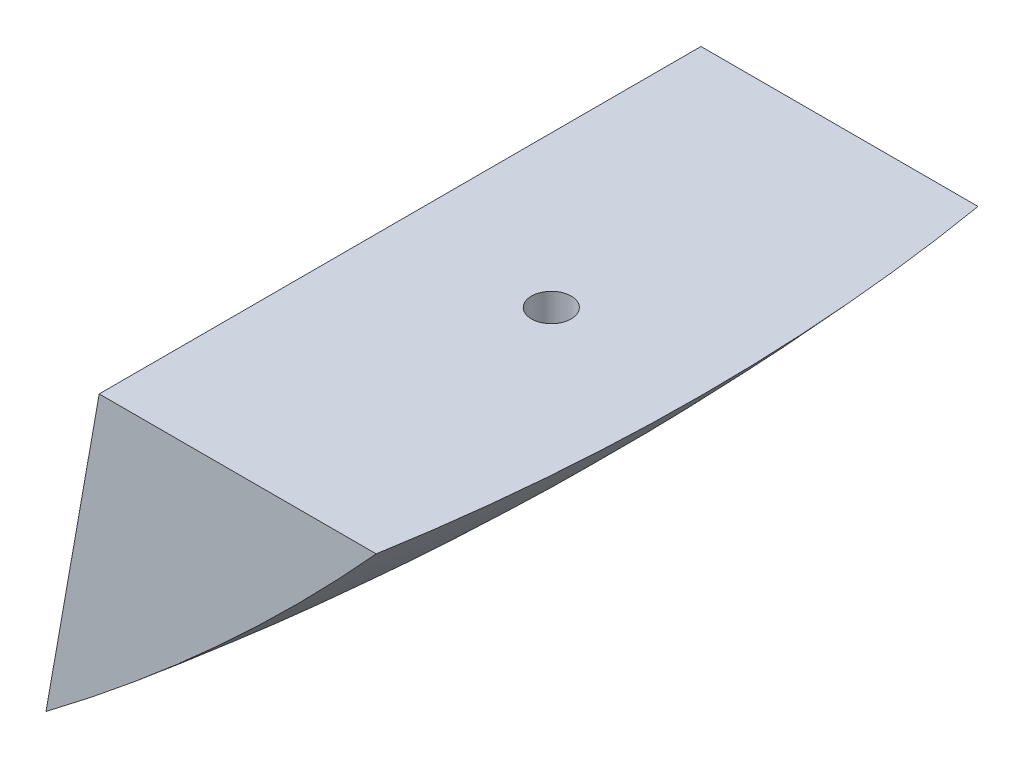
ISO-10303-21;
HEADER;
FILE_DESCRIPTION(('STEP AP214'),'2;1');
FILE_NAME('part.step','',(''),(''),'','','');
FILE_SCHEMA(('AUTOMOTIVE_DESIGN { 1 0 10303 214 1 1 1 1 }'));
ENDSEC;
DATA;
#1=APPLICATION_CONTEXT('core data for automotive mechanical design processes');
#2=APPLICATION_PROTOCOL_DEFINITION('international standard','automotive_design',2000,#1);
#3=PRODUCT_CONTEXT('',#1,'mechanical');
#4=PRODUCT('Part','Part','',(#3));
#5=PRODUCT_RELATED_PRODUCT_CATEGORY('part','',(#4));
#6=PRODUCT_DEFINITION_FORMATION('','',#4);
#7=PRODUCT_DEFINITION_CONTEXT('part definition',#1,'design');
#8=PRODUCT_DEFINITION('design','',#6,#7);
#9=PRODUCT_DEFINITION_SHAPE('','',#8);
#10=(LENGTH_UNIT() NAMED_UNIT(*) SI_UNIT(.MILLI.,.METRE.));
#11=(NAMED_UNIT(*) PLANE_ANGLE_UNIT() SI_UNIT($,.RADIAN.));
#12=(NAMED_UNIT(*) SI_UNIT($,.STERADIAN.) SOLID_ANGLE_UNIT());
#13=UNCERTAINTY_MEASURE_WITH_UNIT(LENGTH_MEASURE(1.E-05),#10,'distance_accuracy_value','');
#14=(GEOMETRIC_REPRESENTATION_CONTEXT(3) GLOBAL_UNCERTAINTY_ASSIGNED_CONTEXT((#13)) GLOBAL_UNIT_ASSIGNED_CONTEXT((#10,
#11,#12)) REPRESENTATION_CONTEXT('',''));
#15=CARTESIAN_POINT('',(0.,0.,0.));
#16=DIRECTION('',(0.,0.,1.));
#17=DIRECTION('',(1.,0.,0.));
#18=AXIS2_PLACEMENT_3D('',#15,#16,#17);
#19=CARTESIAN_POINT('',(0.,89.8877777778637,0.));
#20=DIRECTION('',(0.,1.,0.));
#21=DIRECTION('',(0.819152044288991,0.,0.573576436351047));
#22=AXIS2_PLACEMENT_3D('',#19,#20,#21);
#23=SPHERICAL_SURFACE('',#22,200.025);
#24=CARTESIAN_POINT('',(135.304993525484,-57.4259187218492,-1.11089376189419));
#25=CARTESIAN_POINT('',(135.253894967539,-57.4732748733322,-1.0547755069715));
#26=CARTESIAN_POINT('',(135.205526359196,-57.5180784508502,-0.993882238328989));
#27=CARTESIAN_POINT('',(135.116170441705,-57.6008155462596,-0.862555653471321));
#28=CARTESIAN_POINT('',(135.075187110182,-57.638745362084,-0.792117231912984));
#29=CARTESIAN_POINT('',(135.00844146317,-57.7004995632273,-0.653843099320736));
#30=CARTESIAN_POINT('',(134.981311907754,-57.7255921323469,-0.587242769430468));
#31=CARTESIAN_POINT('',(134.935549252415,-57.7679111725258,-0.448827223831902));
#32=CARTESIAN_POINT('',(134.916908015399,-57.7851451770045,-0.377017079271747));
#33=CARTESIAN_POINT('',(134.88931097189,-57.8106567329115,-0.229518056935983));
#34=CARTESIAN_POINT('',(134.880413330759,-57.8188804969633,-0.153808680482446));
#35=CARTESIAN_POINT('',(134.873241361785,-57.8255094024284,-0.00145759508587165));
#36=CARTESIAN_POINT('',(134.874964419583,-57.8239169601703,0.0751838797789873));
#37=CARTESIAN_POINT('',(134.88818156645,-57.8117002223462,0.219170313374044));
#38=CARTESIAN_POINT('',(134.898697120392,-57.8019804331997,0.286687744844931));
#39=CARTESIAN_POINT('',(134.927536020641,-57.7753192227511,0.41852657622424));
#40=CARTESIAN_POINT('',(134.945860151873,-57.7583770754504,0.482847654106088));
#41=CARTESIAN_POINT('',(134.990338354715,-57.7172434818056,0.609969906726254));
#42=CARTESIAN_POINT('',(135.01682185318,-57.6927469859933,0.672555201469006));
#43=CARTESIAN_POINT('',(135.075971258397,-57.6380184373004,0.79200187419917));
#44=CARTESIAN_POINT('',(135.108640663871,-57.6077831385549,0.848859984900354));
#45=CARTESIAN_POINT('',(135.196582860327,-57.5263639028565,0.983415334934692));
#46=CARTESIAN_POINT('',(135.254988945946,-57.4722654371916,1.05731386600327));
#47=CARTESIAN_POINT('',(135.379746052147,-57.3566362334437,1.19135132064767));
#48=CARTESIAN_POINT('',(135.446115607065,-57.2950881539536,1.25145715833303));
#49=CARTESIAN_POINT('',(135.607460937307,-57.1453607689671,1.37630768446766));
#50=CARTESIAN_POINT('',(135.704573811715,-57.0551650825326,1.43586626569291));
#51=CARTESIAN_POINT('',(135.904357635023,-56.8694283863695,1.53285760930142));
#52=CARTESIAN_POINT('',(136.007031723911,-56.7738843558021,1.57027772660854));
#53=CARTESIAN_POINT('',(136.217254695792,-56.5780616808425,1.62474989288963));
#54=CARTESIAN_POINT('',(136.324860150257,-56.4777263881313,1.64137536532568));
#55=CARTESIAN_POINT('',(136.540663790621,-56.2762932720311,1.65346432617502));
#56=CARTESIAN_POINT('',(136.648862408706,-56.1751948641455,1.64890949771485));
#57=CARTESIAN_POINT('',(136.881280303974,-55.957804320785,1.61602336156161));
#58=CARTESIAN_POINT('',(137.005207153897,-55.8417485136548,1.58390414152929));
#59=CARTESIAN_POINT('',(137.246680164142,-55.6153509266891,1.48944370397862));
#60=CARTESIAN_POINT('',(137.364236642519,-55.5049999210225,1.42715308705153));
#61=CARTESIAN_POINT('',(137.546138511475,-55.3340700024225,1.29892717581881));
#62=CARTESIAN_POINT('',(137.614179475109,-55.270087167089,1.24271834143865));
#63=CARTESIAN_POINT('',(137.743126498149,-55.1487579952525,1.11659071317977));
#64=CARTESIAN_POINT('',(137.804044202156,-55.0914008294874,1.04669480889591));
#65=CARTESIAN_POINT('',(137.903658771645,-54.9975611525693,0.909586301806574));
#66=CARTESIAN_POINT('',(137.9443125928,-54.9592463143106,0.845058985192953));
#67=CARTESIAN_POINT('',(138.017498999038,-54.8902483064039,0.707794292214268));
#68=CARTESIAN_POINT('',(138.050040917857,-54.8595563658304,0.635066492817585));
#69=CARTESIAN_POINT('',(138.100518306161,-54.8119378529552,0.494845076156713));
#70=CARTESIAN_POINT('',(138.11995846047,-54.7935938524906,0.428378951334078));
#71=CARTESIAN_POINT('',(138.150476633368,-54.7647932865098,0.291897259360916));
#72=CARTESIAN_POINT('',(138.161559670389,-54.7543319874506,0.221883849350005));
#73=CARTESIAN_POINT('',(138.174602507708,-54.742020589217,0.08000716140434));
#74=CARTESIAN_POINT('',(138.176531601208,-54.7401994734405,0.00813846919916267));
#75=CARTESIAN_POINT('',(138.171032331424,-54.7453905409976,-0.134914300262591));
#76=CARTESIAN_POINT('',(138.163603517773,-54.7524031494722,-0.206098344402953));
#77=CARTESIAN_POINT('',(138.140568264184,-54.7741442783308,-0.341969938471907));
#78=CARTESIAN_POINT('',(138.125406997596,-54.788452751428,-0.406802839693003));
#79=CARTESIAN_POINT('',(138.088085385449,-54.8236673281733,-0.532513906058892));
#80=CARTESIAN_POINT('',(138.065922342887,-54.8445759741305,-0.59339053638033));
#81=CARTESIAN_POINT('',(138.006847150773,-54.900292005395,-0.730753250803811));
#82=CARTESIAN_POINT('',(137.967487535104,-54.9374028826748,-0.805254209467921));
#83=CARTESIAN_POINT('',(137.880457103447,-55.0194222733934,-0.944461739941213));
#84=CARTESIAN_POINT('',(137.832770947364,-55.0643451783984,-1.00914981494594));
#85=CARTESIAN_POINT('',(137.713945924997,-55.1762249661134,-1.1488846393099));
#86=CARTESIAN_POINT('',(137.640343113149,-55.2454827267166,-1.21998493821412));
#87=CARTESIAN_POINT('',(137.485790038894,-55.3907963349873,-1.34510204199325));
#88=CARTESIAN_POINT('',(137.404828740862,-55.4668623904597,-1.39909262448617));
#89=CARTESIAN_POINT('',(137.212909495409,-55.647026154356,-1.50487456618613));
#90=CARTESIAN_POINT('',(137.1002864849,-55.7526424838093,-1.55105934255086));
#91=CARTESIAN_POINT('',(136.87098959019,-55.967429947445,-1.61773386798331));
#92=CARTESIAN_POINT('',(136.754312760773,-56.0766036624321,-1.63820451614781));
#93=CARTESIAN_POINT('',(136.518534924434,-56.2969685929112,-1.65426277209043));
#94=CARTESIAN_POINT('',(136.39942160929,-56.4081683289469,-1.64955017685996));
#95=CARTESIAN_POINT('',(136.163037145091,-56.6285987292498,-1.61423650939765));
#96=CARTESIAN_POINT('',(136.04576627839,-56.7378290920819,-1.58363150782118));
#97=CARTESIAN_POINT('',(135.836421192942,-56.9326116562942,-1.50289655136856));
#98=CARTESIAN_POINT('',(135.74348179931,-57.019005666081,-1.45702893168549));
#99=CARTESIAN_POINT('',(135.564311167214,-57.1854198335627,-1.34559752983652));
#100=CARTESIAN_POINT('',(135.478052977955,-57.2654656338467,-1.28011869176657));
#101=CARTESIAN_POINT('',(135.365548098901,-57.3697914234781,-1.17475100583058));
#102=CARTESIAN_POINT('',(135.334806180681,-57.3982895152255,-1.1436350808583));
#103=CARTESIAN_POINT('',(135.304993525484,-57.4259187218492,-1.11089376189419));
#104=B_SPLINE_CURVE_WITH_KNOTS('',3,(#24,#25,#26,#27,#28,#29,#30,#31,#32,#33,#34,#35,#36,#37,
#38,#39,#40,#41,#42,#43,#44,#45,#46,#47,#48,#49,#50,#51,#52,#53,#54,#55,#56,#57,#58,#59,#60,#61,
#62,#63,#64,#65,#66,#67,#68,#69,#70,#71,#72,#73,#74,#75,#76,#77,#78,#79,#80,#81,#82,#83,#84,#85,
#86,#87,#88,#89,#90,#91,#92,#93,#94,#95,#96,#97,#98,#99,#100,#101,#102,#103),.UNSPECIFIED.,.T.,
.F.,(4,2,2,2,2,2,2,2,2,2,2,2,2,2,2,2,2,2,2,2,2,2,2,2,2,2,2,2,2,2,2,2,2,2,2,2,2,2,2,4),(0.,
0.268262640804345,0.536669335740845,0.764227111751158,0.991566284125334,1.22025530444012,
1.44888803358525,1.6550146627113,1.86116201677682,2.07706240867133,2.29308527960895,
2.61714204229844,2.94196820988617,3.37556322278975,3.80940565853795,4.25200918637316,
4.69499555200883,5.21085190819347,5.72584609919212,6.05184782923504,6.37730895537032,
6.63242535123113,6.88724683531151,7.10125269845404,7.31512994895825,7.52972414344342,
7.74432866610314,7.94777736778772,8.15130453134651,8.42599867436044,8.70120433490691,
9.0699017923128,9.4391616135256,9.92013144905767,10.4014583465119,10.8885357234317,
11.3756870308398,11.7790706050369,12.1807316273042,12.3372452733687),.UNSPECIFIED.);
#105=CARTESIAN_POINT('',(135.304993525484,-57.4259187218492,-1.11089376189419));
#106=VERTEX_POINT('',#105);
#107=EDGE_CURVE('E97',#106,#106,#104,.T.);
#108=ORIENTED_EDGE('',*,*,#107,.T.);
#109=EDGE_LOOP('',(#108));
#110=FACE_BOUND('',#109,.T.);
#111=CARTESIAN_POINT('',(0.,89.8877777778637,25.));
#112=DIRECTION('',(0.,0.,1.));
#113=DIRECTION('',(1.,0.,0.));
#114=AXIS2_PLACEMENT_3D('',#111,#112,#113);
#115=CIRCLE('',#114,198.456545936384);
#116=CARTESIAN_POINT('',(119.540692541846,-68.5263107736788,25.));
#117=VERTEX_POINT('',#116);
#118=CARTESIAN_POINT('',(146.978835636292,-43.4622222221363,25.));
#119=VERTEX_POINT('',#118);
#120=EDGE_CURVE('E88',#117,#119,#115,.T.);
#121=ORIENTED_EDGE('',*,*,#120,.F.);
#122=CARTESIAN_POINT('',(143.026504239129,64.6683461240922,0.));
#123=DIRECTION('',(0.984807753012209,-0.173648177666926,0.));
#124=DIRECTION('',(0.173648177666926,0.984807753012209,0.));
#125=AXIS2_PLACEMENT_3D('',#122,#123,#124);
#126=CIRCLE('',#125,137.540539395464);
#127=CARTESIAN_POINT('',(119.14284021778,-70.7826434260417,2.198420330519E-13));
#128=VERTEX_POINT('',#127);
#129=EDGE_CURVE('E92',#117,#128,#126,.T.);
#130=ORIENTED_EDGE('',*,*,#129,.T.);
#131=CARTESIAN_POINT('',(119.540692541846,-68.5263107736788,-25.));
#132=VERTEX_POINT('',#131);
#133=EDGE_CURVE('E87',#128,#132,#126,.T.);
#134=ORIENTED_EDGE('',*,*,#133,.T.);
#135=CARTESIAN_POINT('',(0.,89.8877777778637,-25.));
#136=DIRECTION('',(0.,0.,-1.));
#137=DIRECTION('',(-1.,0.,0.));
#138=AXIS2_PLACEMENT_3D('',#135,#136,#137);
#139=CIRCLE('',#138,198.456545936384);
#140=CARTESIAN_POINT('',(146.978835636292,-43.4622222221363,-25.));
#141=VERTEX_POINT('',#140);
#142=EDGE_CURVE('E60',#141,#132,#139,.T.);
#143=ORIENTED_EDGE('',*,*,#142,.F.);
#144=CARTESIAN_POINT('',(0.,-43.4622222221363,0.));
#145=DIRECTION('',(0.,1.,0.));
#146=DIRECTION('',(-1.,0.,0.));
#147=AXIS2_PLACEMENT_3D('',#144,#145,#146);
#148=CIRCLE('',#147,149.089832399798);
#149=CARTESIAN_POINT('',(149.089832399798,-43.4622222221363,0.));
#150=VERTEX_POINT('',#149);
#151=EDGE_CURVE('E53',#150,#141,#148,.T.);
#152=ORIENTED_EDGE('',*,*,#151,.F.);
#153=EDGE_CURVE('E91',#119,#150,#148,.T.);
#154=ORIENTED_EDGE('',*,*,#153,.F.);
#155=EDGE_LOOP('',(#121,#130,#134,#143,#152,#154));
#156=FACE_BOUND('',#155,.T.);
#157=ADVANCED_FACE('F38',(#110,#156),#23,.T.);
#158=CARTESIAN_POINT('',(101.542224700231,-43.4622222221363,71.1006311816865));
#159=DIRECTION('',(0.,-1.,0.));
#160=DIRECTION('',(1.,0.,0.));
#161=AXIS2_PLACEMENT_3D('',#158,#159,#160);
#162=PLANE('',#161);
#163=CARTESIAN_POINT('',(136.525000000074,-43.4622222221363,0.));
#164=DIRECTION('',(0.,1.,0.));
#165=DIRECTION('',(0.,0.,1.));
#166=AXIS2_PLACEMENT_3D('',#163,#164,#165);
#167=CIRCLE('',#166,1.64999999999998);
#168=CARTESIAN_POINT('',(136.525000000074,-43.4622222221363,1.64999999999998));
#169=VERTEX_POINT('',#168);
#170=EDGE_CURVE('E103',#169,#169,#167,.T.);
#171=ORIENTED_EDGE('',*,*,#170,.F.);
#172=EDGE_LOOP('',(#171));
#173=FACE_BOUND('',#172,.T.);
#174=DIRECTION('',(1.,0.,0.));
#175=VECTOR('',#174,1.);
#176=CARTESIAN_POINT('',(119.142840217781,-43.4622222221363,25.));
#177=LINE('',#176,#175);
#178=CARTESIAN_POINT('',(123.960167600349,-43.4622222221363,25.));
#179=VERTEX_POINT('',#178);
#180=EDGE_CURVE('E82',#179,#119,#177,.T.);
#181=ORIENTED_EDGE('',*,*,#180,.T.);
#182=ORIENTED_EDGE('',*,*,#153,.T.);
#183=ORIENTED_EDGE('',*,*,#151,.T.);
#184=DIRECTION('',(-1.,0.,0.));
#185=VECTOR('',#184,1.);
#186=CARTESIAN_POINT('',(119.14284021778,-43.4622222221363,-25.));
#187=LINE('',#186,#185);
#188=CARTESIAN_POINT('',(123.960167600349,-43.4622222221363,-25.));
#189=VERTEX_POINT('',#188);
#190=EDGE_CURVE('E77',#141,#189,#187,.T.);
#191=ORIENTED_EDGE('',*,*,#190,.T.);
#192=DIRECTION('',(0.,0.,1.));
#193=VECTOR('',#192,1.);
#194=CARTESIAN_POINT('',(123.960167600349,-43.4622222221363,-100.5));
#195=LINE('',#194,#193);
#196=EDGE_CURVE('E102',#189,#179,#195,.T.);
#197=ORIENTED_EDGE('',*,*,#196,.T.);
#198=EDGE_LOOP('',(#181,#182,#183,#191,#197));
#199=FACE_BOUND('',#198,.T.);
#200=ADVANCED_FACE('F40',(#173,#199),#162,.F.);
#201=CARTESIAN_POINT('',(119.14284021778,-70.7826434260418,-100.5));
#202=DIRECTION('',(0.984807753012209,-0.173648177666926,0.));
#203=DIRECTION('',(0.173648177666926,0.984807753012209,0.));
#204=AXIS2_PLACEMENT_3D('',#201,#202,#203);
#205=PLANE('',#204);
#206=DIRECTION('',(-0.173648177666926,-0.984807753012209,0.));
#207=VECTOR('',#206,1.);
#208=CARTESIAN_POINT('',(119.14284021778,-70.7826434260418,25.));
#209=LINE('',#208,#207);
#210=EDGE_CURVE('E12',#179,#117,#209,.T.);
#211=ORIENTED_EDGE('',*,*,#210,.F.);
#212=ORIENTED_EDGE('',*,*,#196,.F.);
#213=DIRECTION('',(0.173648177666926,0.984807753012209,0.));
#214=VECTOR('',#213,1.);
#215=CARTESIAN_POINT('',(119.14284021778,-70.7826434260418,-25.));
#216=LINE('',#215,#214);
#217=EDGE_CURVE('E46',#132,#189,#216,.T.);
#218=ORIENTED_EDGE('',*,*,#217,.F.);
#219=ORIENTED_EDGE('',*,*,#133,.F.);
#220=ORIENTED_EDGE('',*,*,#129,.F.);
#221=EDGE_LOOP('',(#211,#212,#218,#219,#220));
#222=FACE_BOUND('',#221,.T.);
#223=ADVANCED_FACE('F110',(#222),#205,.F.);
#224=CARTESIAN_POINT('',(136.525000000074,-43.4622222221363,0.));
#225=DIRECTION('',(0.,1.,0.));
#226=DIRECTION('',(0.,0.,1.));
#227=AXIS2_PLACEMENT_3D('',#224,#225,#226);
#228=CYLINDRICAL_SURFACE('',#227,1.64999999999998);
#229=ORIENTED_EDGE('',*,*,#170,.T.);
#230=EDGE_LOOP('',(#229));
#231=FACE_BOUND('',#230,.T.);
#232=ORIENTED_EDGE('',*,*,#107,.F.);
#233=EDGE_LOOP('',(#232));
#234=FACE_BOUND('',#233,.T.);
#235=ADVANCED_FACE('F106',(#231,#234),#228,.F.);
#236=CARTESIAN_POINT('',(119.14284021778,-134.462222222136,-25.));
#237=DIRECTION('',(0.,0.,-1.));
#238=DIRECTION('',(-1.,0.,0.));
#239=AXIS2_PLACEMENT_3D('',#236,#237,#238);
#240=PLANE('',#239);
#241=ORIENTED_EDGE('',*,*,#142,.T.);
#242=ORIENTED_EDGE('',*,*,#217,.T.);
#243=ORIENTED_EDGE('',*,*,#190,.F.);
#244=EDGE_LOOP('',(#241,#242,#243));
#245=FACE_BOUND('',#244,.T.);
#246=ADVANCED_FACE('F78',(#245),#240,.T.);
#247=CARTESIAN_POINT('',(119.142840217781,-134.462222222136,25.));
#248=DIRECTION('',(0.,0.,1.));
#249=DIRECTION('',(1.,0.,0.));
#250=AXIS2_PLACEMENT_3D('',#247,#248,#249);
#251=PLANE('',#250);
#252=ORIENTED_EDGE('',*,*,#120,.T.);
#253=ORIENTED_EDGE('',*,*,#180,.F.);
#254=ORIENTED_EDGE('',*,*,#210,.T.);
#255=EDGE_LOOP('',(#252,#253,#254));
#256=FACE_BOUND('',#255,.T.);
#257=ADVANCED_FACE('F145',(#256),#251,.T.);
#258=CLOSED_SHELL('',(#157,#200,#223,#235,#246,#257));
#259=MANIFOLD_SOLID_BREP('B2',#258);
#260=ADVANCED_BREP_SHAPE_REPRESENTATION('',(#18,#259),#14);
#261=SHAPE_DEFINITION_REPRESENTATION(#9,#260);
ENDSEC;
END-ISO-10303-21;
